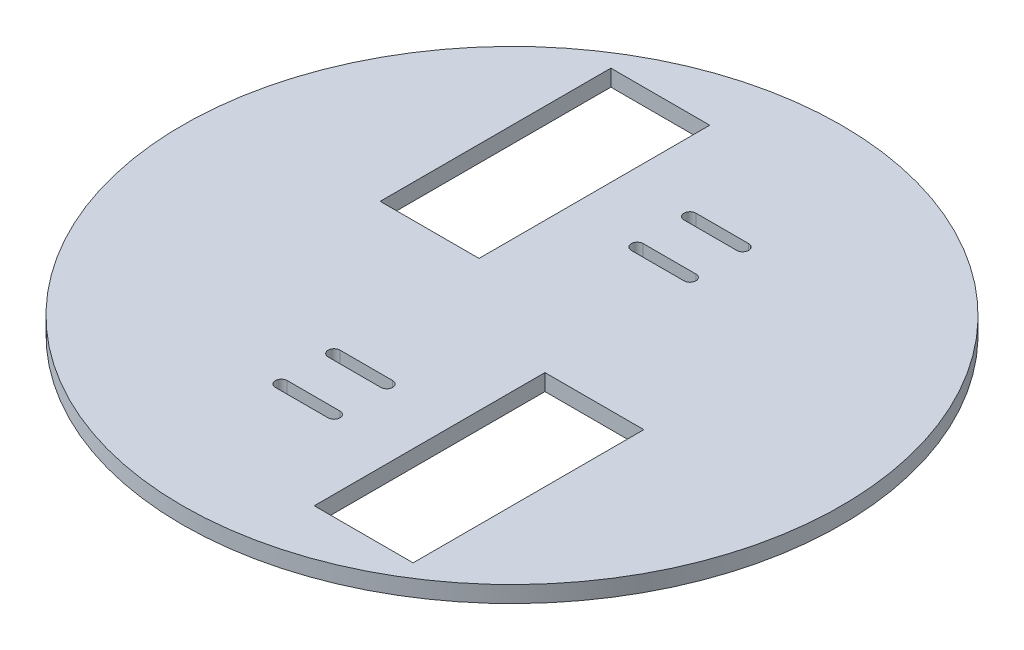
ISO-10303-21;
HEADER;
FILE_DESCRIPTION(('STEP AP214'),'2;1');
FILE_NAME('part.step','',(''),(''),'','','');
FILE_SCHEMA(('AUTOMOTIVE_DESIGN { 1 0 10303 214 1 1 1 1 }'));
ENDSEC;
DATA;
#1=APPLICATION_CONTEXT('core data for automotive mechanical design processes');
#2=APPLICATION_PROTOCOL_DEFINITION('international standard','automotive_design',2000,#1);
#3=PRODUCT_CONTEXT('',#1,'mechanical');
#4=PRODUCT('Part','Part','',(#3));
#5=PRODUCT_RELATED_PRODUCT_CATEGORY('part','',(#4));
#6=PRODUCT_DEFINITION_FORMATION('','',#4);
#7=PRODUCT_DEFINITION_CONTEXT('part definition',#1,'design');
#8=PRODUCT_DEFINITION('design','',#6,#7);
#9=PRODUCT_DEFINITION_SHAPE('','',#8);
#10=(LENGTH_UNIT() NAMED_UNIT(*) SI_UNIT(.MILLI.,.METRE.));
#11=(NAMED_UNIT(*) PLANE_ANGLE_UNIT() SI_UNIT($,.RADIAN.));
#12=(NAMED_UNIT(*) SI_UNIT($,.STERADIAN.) SOLID_ANGLE_UNIT());
#13=UNCERTAINTY_MEASURE_WITH_UNIT(LENGTH_MEASURE(1.E-05),#10,'distance_accuracy_value','');
#14=(GEOMETRIC_REPRESENTATION_CONTEXT(3) GLOBAL_UNCERTAINTY_ASSIGNED_CONTEXT((#13)) GLOBAL_UNIT_ASSIGNED_CONTEXT((#10,
#11,#12)) REPRESENTATION_CONTEXT('',''));
#15=CARTESIAN_POINT('',(0.,0.,0.));
#16=DIRECTION('',(0.,0.,1.));
#17=DIRECTION('',(1.,0.,0.));
#18=AXIS2_PLACEMENT_3D('',#15,#16,#17);
#19=CARTESIAN_POINT('',(0.,5.,0.));
#20=DIRECTION('',(0.,1.,0.));
#21=DIRECTION('',(0.,0.,1.));
#22=AXIS2_PLACEMENT_3D('',#19,#20,#21);
#23=PLANE('',#22);
#24=CARTESIAN_POINT('',(0.,5.,0.));
#25=DIRECTION('',(0.,1.,0.));
#26=DIRECTION('',(0.,0.,1.));
#27=AXIS2_PLACEMENT_3D('',#24,#25,#26);
#28=CIRCLE('',#27,100.);
#29=CARTESIAN_POINT('',(0.,5.,100.));
#30=VERTEX_POINT('',#29);
#31=EDGE_CURVE('E11',#30,#30,#28,.T.);
#32=ORIENTED_EDGE('',*,*,#31,.T.);
#33=EDGE_LOOP('',(#32));
#34=FACE_BOUND('',#33,.T.);
#35=DIRECTION('',(1.,0.,0.));
#36=VECTOR('',#35,1.);
#37=CARTESIAN_POINT('',(20.,5.,80.));
#38=LINE('',#37,#36);
#39=CARTESIAN_POINT('',(20.,5.,80.));
#40=VERTEX_POINT('',#39);
#41=CARTESIAN_POINT('',(50.,5.,80.));
#42=VERTEX_POINT('',#41);
#43=EDGE_CURVE('E371',#40,#42,#38,.T.);
#44=ORIENTED_EDGE('',*,*,#43,.F.);
#45=DIRECTION('',(0.,0.,1.));
#46=VECTOR('',#45,1.);
#47=CARTESIAN_POINT('',(20.,5.,80.));
#48=LINE('',#47,#46);
#49=CARTESIAN_POINT('',(20.,5.,10.));
#50=VERTEX_POINT('',#49);
#51=EDGE_CURVE('E369',#50,#40,#48,.T.);
#52=ORIENTED_EDGE('',*,*,#51,.F.);
#53=DIRECTION('',(-1.,0.,0.));
#54=VECTOR('',#53,1.);
#55=CARTESIAN_POINT('',(20.,5.,10.));
#56=LINE('',#55,#54);
#57=CARTESIAN_POINT('',(50.,5.,10.));
#58=VERTEX_POINT('',#57);
#59=EDGE_CURVE('E377',#58,#50,#56,.T.);
#60=ORIENTED_EDGE('',*,*,#59,.F.);
#61=DIRECTION('',(0.,0.,-1.));
#62=VECTOR('',#61,1.);
#63=CARTESIAN_POINT('',(50.,5.,80.));
#64=LINE('',#63,#62);
#65=EDGE_CURVE('E374',#42,#58,#64,.T.);
#66=ORIENTED_EDGE('',*,*,#65,.F.);
#67=EDGE_LOOP('',(#44,#52,#60,#66));
#68=FACE_BOUND('',#67,.T.);
#69=DIRECTION('',(1.,0.,0.));
#70=VECTOR('',#69,1.);
#71=CARTESIAN_POINT('',(-17.0000000000001,5.,54.7999999999999));
#72=LINE('',#71,#70);
#73=CARTESIAN_POINT('',(-17.0000000000001,5.,54.7999999999999));
#74=VERTEX_POINT('',#73);
#75=CARTESIAN_POINT('',(-1.00000000000005,5.,54.8));
#76=VERTEX_POINT('',#75);
#77=EDGE_CURVE('E366',#74,#76,#72,.T.);
#78=ORIENTED_EDGE('',*,*,#77,.F.);
#79=CARTESIAN_POINT('',(-17.,5.,52.9999999999999));
#80=DIRECTION('',(0.,1.,0.));
#81=DIRECTION('',(0.,0.,-1.));
#82=AXIS2_PLACEMENT_3D('',#79,#80,#81);
#83=CIRCLE('',#82,1.8);
#84=CARTESIAN_POINT('',(-17.,5.,51.1999999999999));
#85=VERTEX_POINT('',#84);
#86=EDGE_CURVE('E354',#85,#74,#83,.T.);
#87=ORIENTED_EDGE('',*,*,#86,.F.);
#88=DIRECTION('',(-1.,0.,0.));
#89=VECTOR('',#88,1.);
#90=CARTESIAN_POINT('',(-17.,5.,51.1999999999999));
#91=LINE('',#90,#89);
#92=CARTESIAN_POINT('',(-1.00000000000003,5.,51.2));
#93=VERTEX_POINT('',#92);
#94=EDGE_CURVE('E349',#93,#85,#91,.T.);
#95=ORIENTED_EDGE('',*,*,#94,.F.);
#96=CARTESIAN_POINT('',(-1.00000000000004,5.,53.));
#97=DIRECTION('',(0.,1.,0.));
#98=DIRECTION('',(0.,0.,-1.));
#99=AXIS2_PLACEMENT_3D('',#96,#97,#98);
#100=CIRCLE('',#99,1.8);
#101=EDGE_CURVE('E363',#76,#93,#100,.T.);
#102=ORIENTED_EDGE('',*,*,#101,.F.);
#103=EDGE_LOOP('',(#78,#87,#95,#102));
#104=FACE_BOUND('',#103,.T.);
#105=DIRECTION('',(1.,0.,0.));
#106=VECTOR('',#105,1.);
#107=CARTESIAN_POINT('',(-17.,5.,38.8));
#108=LINE('',#107,#106);
#109=CARTESIAN_POINT('',(-17.,5.,38.8));
#110=VERTEX_POINT('',#109);
#111=CARTESIAN_POINT('',(-1.,5.,38.8));
#112=VERTEX_POINT('',#111);
#113=EDGE_CURVE('E309',#110,#112,#108,.T.);
#114=ORIENTED_EDGE('',*,*,#113,.F.);
#115=CARTESIAN_POINT('',(-17.,5.,37.));
#116=DIRECTION('',(0.,1.,0.));
#117=DIRECTION('',(0.,0.,1.));
#118=AXIS2_PLACEMENT_3D('',#115,#116,#117);
#119=CIRCLE('',#118,1.8);
#120=CARTESIAN_POINT('',(-17.,5.,35.2));
#121=VERTEX_POINT('',#120);
#122=EDGE_CURVE('E307',#121,#110,#119,.T.);
#123=ORIENTED_EDGE('',*,*,#122,.F.);
#124=DIRECTION('',(-1.,0.,0.));
#125=VECTOR('',#124,1.);
#126=CARTESIAN_POINT('',(-17.,5.,35.2));
#127=LINE('',#126,#125);
#128=CARTESIAN_POINT('',(-1.,5.,35.2));
#129=VERTEX_POINT('',#128);
#130=EDGE_CURVE('E315',#129,#121,#127,.T.);
#131=ORIENTED_EDGE('',*,*,#130,.F.);
#132=CARTESIAN_POINT('',(-1.,5.,37.));
#133=DIRECTION('',(0.,1.,0.));
#134=DIRECTION('',(0.,0.,1.));
#135=AXIS2_PLACEMENT_3D('',#132,#133,#134);
#136=CIRCLE('',#135,1.8);
#137=EDGE_CURVE('E312',#112,#129,#136,.T.);
#138=ORIENTED_EDGE('',*,*,#137,.F.);
#139=EDGE_LOOP('',(#114,#123,#131,#138));
#140=FACE_BOUND('',#139,.T.);
#141=DIRECTION('',(-1.,0.,0.));
#142=VECTOR('',#141,1.);
#143=CARTESIAN_POINT('',(-20.,5.,-80.));
#144=LINE('',#143,#142);
#145=CARTESIAN_POINT('',(-20.,5.,-80.));
#146=VERTEX_POINT('',#145);
#147=CARTESIAN_POINT('',(-50.,5.,-80.));
#148=VERTEX_POINT('',#147);
#149=EDGE_CURVE('E278',#146,#148,#144,.T.);
#150=ORIENTED_EDGE('',*,*,#149,.F.);
#151=DIRECTION('',(0.,0.,-1.));
#152=VECTOR('',#151,1.);
#153=CARTESIAN_POINT('',(-20.,5.,-80.));
#154=LINE('',#153,#152);
#155=CARTESIAN_POINT('',(-20.,5.,-10.));
#156=VERTEX_POINT('',#155);
#157=EDGE_CURVE('E276',#156,#146,#154,.T.);
#158=ORIENTED_EDGE('',*,*,#157,.F.);
#159=DIRECTION('',(1.,0.,0.));
#160=VECTOR('',#159,1.);
#161=CARTESIAN_POINT('',(-20.,5.,-10.));
#162=LINE('',#161,#160);
#163=CARTESIAN_POINT('',(-50.,5.,-10.));
#164=VERTEX_POINT('',#163);
#165=EDGE_CURVE('E284',#164,#156,#162,.T.);
#166=ORIENTED_EDGE('',*,*,#165,.F.);
#167=DIRECTION('',(0.,0.,1.));
#168=VECTOR('',#167,1.);
#169=CARTESIAN_POINT('',(-50.,5.,-80.));
#170=LINE('',#169,#168);
#171=EDGE_CURVE('E281',#148,#164,#170,.T.);
#172=ORIENTED_EDGE('',*,*,#171,.F.);
#173=EDGE_LOOP('',(#150,#158,#166,#172));
#174=FACE_BOUND('',#173,.T.);
#175=DIRECTION('',(-1.,0.,0.));
#176=VECTOR('',#175,1.);
#177=CARTESIAN_POINT('',(17.0000000000001,5.,-54.7999999999999));
#178=LINE('',#177,#176);
#179=CARTESIAN_POINT('',(17.0000000000001,5.,-54.7999999999999));
#180=VERTEX_POINT('',#179);
#181=CARTESIAN_POINT('',(1.00000000000005,5.,-54.8));
#182=VERTEX_POINT('',#181);
#183=EDGE_CURVE('E250',#180,#182,#178,.T.);
#184=ORIENTED_EDGE('',*,*,#183,.F.);
#185=CARTESIAN_POINT('',(17.,5.,-52.9999999999999));
#186=DIRECTION('',(0.,1.,0.));
#187=DIRECTION('',(0.,0.,1.));
#188=AXIS2_PLACEMENT_3D('',#185,#186,#187);
#189=CIRCLE('',#188,1.8);
#190=CARTESIAN_POINT('',(17.,5.,-51.1999999999999));
#191=VERTEX_POINT('',#190);
#192=EDGE_CURVE('E248',#191,#180,#189,.T.);
#193=ORIENTED_EDGE('',*,*,#192,.F.);
#194=DIRECTION('',(1.,0.,0.));
#195=VECTOR('',#194,1.);
#196=CARTESIAN_POINT('',(17.,5.,-51.1999999999999));
#197=LINE('',#196,#195);
#198=CARTESIAN_POINT('',(1.00000000000003,5.,-51.2));
#199=VERTEX_POINT('',#198);
#200=EDGE_CURVE('E255',#199,#191,#197,.T.);
#201=ORIENTED_EDGE('',*,*,#200,.F.);
#202=CARTESIAN_POINT('',(1.00000000000004,5.,-53.));
#203=DIRECTION('',(0.,1.,0.));
#204=DIRECTION('',(0.,0.,1.));
#205=AXIS2_PLACEMENT_3D('',#202,#203,#204);
#206=CIRCLE('',#205,1.8);
#207=EDGE_CURVE('E253',#182,#199,#206,.T.);
#208=ORIENTED_EDGE('',*,*,#207,.F.);
#209=EDGE_LOOP('',(#184,#193,#201,#208));
#210=FACE_BOUND('',#209,.T.);
#211=DIRECTION('',(-1.,0.,0.));
#212=VECTOR('',#211,1.);
#213=CARTESIAN_POINT('',(17.,5.,-38.8));
#214=LINE('',#213,#212);
#215=CARTESIAN_POINT('',(17.,5.,-38.8));
#216=VERTEX_POINT('',#215);
#217=CARTESIAN_POINT('',(1.,5.,-38.8));
#218=VERTEX_POINT('',#217);
#219=EDGE_CURVE('E218',#216,#218,#214,.T.);
#220=ORIENTED_EDGE('',*,*,#219,.F.);
#221=CARTESIAN_POINT('',(17.,5.,-37.));
#222=DIRECTION('',(0.,1.,0.));
#223=DIRECTION('',(0.,0.,-1.));
#224=AXIS2_PLACEMENT_3D('',#221,#222,#223);
#225=CIRCLE('',#224,1.8);
#226=CARTESIAN_POINT('',(17.,5.,-35.2));
#227=VERTEX_POINT('',#226);
#228=EDGE_CURVE('E208',#227,#216,#225,.T.);
#229=ORIENTED_EDGE('',*,*,#228,.F.);
#230=DIRECTION('',(1.,0.,0.));
#231=VECTOR('',#230,1.);
#232=CARTESIAN_POINT('',(17.,5.,-35.2));
#233=LINE('',#232,#231);
#234=CARTESIAN_POINT('',(1.,5.,-35.2));
#235=VERTEX_POINT('',#234);
#236=EDGE_CURVE('E232',#235,#227,#233,.T.);
#237=ORIENTED_EDGE('',*,*,#236,.F.);
#238=CARTESIAN_POINT('',(1.,5.,-37.));
#239=DIRECTION('',(0.,1.,0.));
#240=DIRECTION('',(0.,0.,-1.));
#241=AXIS2_PLACEMENT_3D('',#238,#239,#240);
#242=CIRCLE('',#241,1.8);
#243=EDGE_CURVE('E230',#218,#235,#242,.T.);
#244=ORIENTED_EDGE('',*,*,#243,.F.);
#245=EDGE_LOOP('',(#220,#229,#237,#244));
#246=FACE_BOUND('',#245,.T.);
#247=ADVANCED_FACE('F46',(#34,#68,#104,#140,#174,#210,#246),#23,.T.);
#248=CARTESIAN_POINT('',(0.,0.,0.));
#249=DIRECTION('',(0.,1.,0.));
#250=DIRECTION('',(0.,0.,1.));
#251=AXIS2_PLACEMENT_3D('',#248,#249,#250);
#252=PLANE('',#251);
#253=CARTESIAN_POINT('',(17.,0.,-52.9999999999999));
#254=DIRECTION('',(0.,1.,0.));
#255=DIRECTION('',(0.,0.,1.));
#256=AXIS2_PLACEMENT_3D('',#253,#254,#255);
#257=CIRCLE('',#256,1.8);
#258=CARTESIAN_POINT('',(17.,0.,-51.1999999999999));
#259=VERTEX_POINT('',#258);
#260=CARTESIAN_POINT('',(17.0000000000001,0.,-54.7999999999999));
#261=VERTEX_POINT('',#260);
#262=EDGE_CURVE('E258',#259,#261,#257,.T.);
#263=ORIENTED_EDGE('',*,*,#262,.T.);
#264=DIRECTION('',(-1.,0.,0.));
#265=VECTOR('',#264,1.);
#266=CARTESIAN_POINT('',(17.0000000000001,0.,-54.7999999999999));
#267=LINE('',#266,#265);
#268=CARTESIAN_POINT('',(1.00000000000005,0.,-54.8));
#269=VERTEX_POINT('',#268);
#270=EDGE_CURVE('E261',#261,#269,#267,.T.);
#271=ORIENTED_EDGE('',*,*,#270,.T.);
#272=CARTESIAN_POINT('',(1.00000000000004,0.,-53.));
#273=DIRECTION('',(0.,1.,0.));
#274=DIRECTION('',(0.,0.,1.));
#275=AXIS2_PLACEMENT_3D('',#272,#273,#274);
#276=CIRCLE('',#275,1.8);
#277=CARTESIAN_POINT('',(1.00000000000003,0.,-51.2));
#278=VERTEX_POINT('',#277);
#279=EDGE_CURVE('E264',#269,#278,#276,.T.);
#280=ORIENTED_EDGE('',*,*,#279,.T.);
#281=DIRECTION('',(1.,0.,0.));
#282=VECTOR('',#281,1.);
#283=CARTESIAN_POINT('',(17.,0.,-51.1999999999999));
#284=LINE('',#283,#282);
#285=EDGE_CURVE('E251',#278,#259,#284,.T.);
#286=ORIENTED_EDGE('',*,*,#285,.T.);
#287=EDGE_LOOP('',(#263,#271,#280,#286));
#288=FACE_BOUND('',#287,.T.);
#289=CARTESIAN_POINT('',(-17.,0.,37.));
#290=DIRECTION('',(0.,1.,0.));
#291=DIRECTION('',(0.,0.,1.));
#292=AXIS2_PLACEMENT_3D('',#289,#290,#291);
#293=CIRCLE('',#292,1.8);
#294=CARTESIAN_POINT('',(-17.,0.,35.2));
#295=VERTEX_POINT('',#294);
#296=CARTESIAN_POINT('',(-17.,0.,38.8));
#297=VERTEX_POINT('',#296);
#298=EDGE_CURVE('E318',#295,#297,#293,.T.);
#299=ORIENTED_EDGE('',*,*,#298,.T.);
#300=DIRECTION('',(1.,0.,0.));
#301=VECTOR('',#300,1.);
#302=CARTESIAN_POINT('',(-17.,0.,38.8));
#303=LINE('',#302,#301);
#304=CARTESIAN_POINT('',(-1.,0.,38.8));
#305=VERTEX_POINT('',#304);
#306=EDGE_CURVE('E321',#297,#305,#303,.T.);
#307=ORIENTED_EDGE('',*,*,#306,.T.);
#308=CARTESIAN_POINT('',(-1.,0.,37.));
#309=DIRECTION('',(0.,1.,0.));
#310=DIRECTION('',(0.,0.,1.));
#311=AXIS2_PLACEMENT_3D('',#308,#309,#310);
#312=CIRCLE('',#311,1.8);
#313=CARTESIAN_POINT('',(-1.,0.,35.2));
#314=VERTEX_POINT('',#313);
#315=EDGE_CURVE('E325',#305,#314,#312,.T.);
#316=ORIENTED_EDGE('',*,*,#315,.T.);
#317=DIRECTION('',(-1.,0.,0.));
#318=VECTOR('',#317,1.);
#319=CARTESIAN_POINT('',(-17.,0.,35.2));
#320=LINE('',#319,#318);
#321=EDGE_CURVE('E310',#314,#295,#320,.T.);
#322=ORIENTED_EDGE('',*,*,#321,.T.);
#323=EDGE_LOOP('',(#299,#307,#316,#322));
#324=FACE_BOUND('',#323,.T.);
#325=DIRECTION('',(0.,0.,1.));
#326=VECTOR('',#325,1.);
#327=CARTESIAN_POINT('',(20.,0.,80.));
#328=LINE('',#327,#326);
#329=CARTESIAN_POINT('',(20.,0.,10.));
#330=VERTEX_POINT('',#329);
#331=CARTESIAN_POINT('',(20.,0.,80.));
#332=VERTEX_POINT('',#331);
#333=EDGE_CURVE('E339',#330,#332,#328,.T.);
#334=ORIENTED_EDGE('',*,*,#333,.T.);
#335=DIRECTION('',(1.,0.,0.));
#336=VECTOR('',#335,1.);
#337=CARTESIAN_POINT('',(20.,0.,80.));
#338=LINE('',#337,#336);
#339=CARTESIAN_POINT('',(50.,0.,80.));
#340=VERTEX_POINT('',#339);
#341=EDGE_CURVE('E382',#332,#340,#338,.T.);
#342=ORIENTED_EDGE('',*,*,#341,.T.);
#343=DIRECTION('',(0.,0.,-1.));
#344=VECTOR('',#343,1.);
#345=CARTESIAN_POINT('',(50.,0.,80.));
#346=LINE('',#345,#344);
#347=CARTESIAN_POINT('',(50.,0.,10.));
#348=VERTEX_POINT('',#347);
#349=EDGE_CURVE('E385',#340,#348,#346,.T.);
#350=ORIENTED_EDGE('',*,*,#349,.T.);
#351=DIRECTION('',(-1.,0.,0.));
#352=VECTOR('',#351,1.);
#353=CARTESIAN_POINT('',(20.,0.,10.));
#354=LINE('',#353,#352);
#355=EDGE_CURVE('E372',#348,#330,#354,.T.);
#356=ORIENTED_EDGE('',*,*,#355,.T.);
#357=EDGE_LOOP('',(#334,#342,#350,#356));
#358=FACE_BOUND('',#357,.T.);
#359=CARTESIAN_POINT('',(0.,0.,0.));
#360=DIRECTION('',(0.,1.,0.));
#361=DIRECTION('',(0.,0.,1.));
#362=AXIS2_PLACEMENT_3D('',#359,#360,#361);
#363=CIRCLE('',#362,100.);
#364=CARTESIAN_POINT('',(0.,0.,100.));
#365=VERTEX_POINT('',#364);
#366=EDGE_CURVE('E50',#365,#365,#363,.T.);
#367=ORIENTED_EDGE('',*,*,#366,.F.);
#368=EDGE_LOOP('',(#367));
#369=FACE_BOUND('',#368,.T.);
#370=CARTESIAN_POINT('',(-17.,0.,52.9999999999999));
#371=DIRECTION('',(0.,1.,0.));
#372=DIRECTION('',(0.,0.,-1.));
#373=AXIS2_PLACEMENT_3D('',#370,#371,#372);
#374=CIRCLE('',#373,1.8);
#375=CARTESIAN_POINT('',(-17.,0.,51.1999999999999));
#376=VERTEX_POINT('',#375);
#377=CARTESIAN_POINT('',(-17.0000000000001,0.,54.7999999999999));
#378=VERTEX_POINT('',#377);
#379=EDGE_CURVE('E322',#376,#378,#374,.T.);
#380=ORIENTED_EDGE('',*,*,#379,.T.);
#381=DIRECTION('',(1.,0.,0.));
#382=VECTOR('',#381,1.);
#383=CARTESIAN_POINT('',(-17.0000000000001,0.,54.7999999999999));
#384=LINE('',#383,#382);
#385=CARTESIAN_POINT('',(-1.00000000000005,0.,54.8));
#386=VERTEX_POINT('',#385);
#387=EDGE_CURVE('E357',#378,#386,#384,.T.);
#388=ORIENTED_EDGE('',*,*,#387,.T.);
#389=CARTESIAN_POINT('',(-1.00000000000004,0.,53.));
#390=DIRECTION('',(0.,1.,0.));
#391=DIRECTION('',(0.,0.,-1.));
#392=AXIS2_PLACEMENT_3D('',#389,#390,#391);
#393=CIRCLE('',#392,1.8);
#394=CARTESIAN_POINT('',(-1.00000000000003,0.,51.2));
#395=VERTEX_POINT('',#394);
#396=EDGE_CURVE('E353',#386,#395,#393,.T.);
#397=ORIENTED_EDGE('',*,*,#396,.T.);
#398=DIRECTION('',(-1.,0.,0.));
#399=VECTOR('',#398,1.);
#400=CARTESIAN_POINT('',(-17.,0.,51.1999999999999));
#401=LINE('',#400,#399);
#402=EDGE_CURVE('E350',#395,#376,#401,.T.);
#403=ORIENTED_EDGE('',*,*,#402,.T.);
#404=EDGE_LOOP('',(#380,#388,#397,#403));
#405=FACE_BOUND('',#404,.T.);
#406=DIRECTION('',(0.,0.,-1.));
#407=VECTOR('',#406,1.);
#408=CARTESIAN_POINT('',(-20.,0.,-80.));
#409=LINE('',#408,#407);
#410=CARTESIAN_POINT('',(-20.,0.,-10.));
#411=VERTEX_POINT('',#410);
#412=CARTESIAN_POINT('',(-20.,0.,-80.));
#413=VERTEX_POINT('',#412);
#414=EDGE_CURVE('E226',#411,#413,#409,.T.);
#415=ORIENTED_EDGE('',*,*,#414,.T.);
#416=DIRECTION('',(-1.,0.,0.));
#417=VECTOR('',#416,1.);
#418=CARTESIAN_POINT('',(-20.,0.,-80.));
#419=LINE('',#418,#417);
#420=CARTESIAN_POINT('',(-50.,0.,-80.));
#421=VERTEX_POINT('',#420);
#422=EDGE_CURVE('E289',#413,#421,#419,.T.);
#423=ORIENTED_EDGE('',*,*,#422,.T.);
#424=DIRECTION('',(0.,0.,1.));
#425=VECTOR('',#424,1.);
#426=CARTESIAN_POINT('',(-50.,0.,-80.));
#427=LINE('',#426,#425);
#428=CARTESIAN_POINT('',(-50.,0.,-10.));
#429=VERTEX_POINT('',#428);
#430=EDGE_CURVE('E292',#421,#429,#427,.T.);
#431=ORIENTED_EDGE('',*,*,#430,.T.);
#432=DIRECTION('',(1.,0.,0.));
#433=VECTOR('',#432,1.);
#434=CARTESIAN_POINT('',(-20.,0.,-10.));
#435=LINE('',#434,#433);
#436=EDGE_CURVE('E279',#429,#411,#435,.T.);
#437=ORIENTED_EDGE('',*,*,#436,.T.);
#438=EDGE_LOOP('',(#415,#423,#431,#437));
#439=FACE_BOUND('',#438,.T.);
#440=CARTESIAN_POINT('',(17.,0.,-37.));
#441=DIRECTION('',(0.,1.,0.));
#442=DIRECTION('',(0.,0.,-1.));
#443=AXIS2_PLACEMENT_3D('',#440,#441,#442);
#444=CIRCLE('',#443,1.8);
#445=CARTESIAN_POINT('',(17.,0.,-35.2));
#446=VERTEX_POINT('',#445);
#447=CARTESIAN_POINT('',(17.,0.,-38.8));
#448=VERTEX_POINT('',#447);
#449=EDGE_CURVE('E236',#446,#448,#444,.T.);
#450=ORIENTED_EDGE('',*,*,#449,.T.);
#451=DIRECTION('',(-1.,0.,0.));
#452=VECTOR('',#451,1.);
#453=CARTESIAN_POINT('',(17.,0.,-38.8));
#454=LINE('',#453,#452);
#455=CARTESIAN_POINT('',(1.,0.,-38.8));
#456=VERTEX_POINT('',#455);
#457=EDGE_CURVE('E225',#448,#456,#454,.T.);
#458=ORIENTED_EDGE('',*,*,#457,.T.);
#459=CARTESIAN_POINT('',(1.,0.,-37.));
#460=DIRECTION('',(0.,1.,0.));
#461=DIRECTION('',(0.,0.,-1.));
#462=AXIS2_PLACEMENT_3D('',#459,#460,#461);
#463=CIRCLE('',#462,1.8);
#464=CARTESIAN_POINT('',(1.,0.,-35.2));
#465=VERTEX_POINT('',#464);
#466=EDGE_CURVE('E240',#456,#465,#463,.T.);
#467=ORIENTED_EDGE('',*,*,#466,.T.);
#468=DIRECTION('',(1.,0.,0.));
#469=VECTOR('',#468,1.);
#470=CARTESIAN_POINT('',(17.,0.,-35.2));
#471=LINE('',#470,#469);
#472=EDGE_CURVE('E219',#465,#446,#471,.T.);
#473=ORIENTED_EDGE('',*,*,#472,.T.);
#474=EDGE_LOOP('',(#450,#458,#467,#473));
#475=FACE_BOUND('',#474,.T.);
#476=ADVANCED_FACE('F404',(#288,#324,#358,#369,#405,#439,#475),#252,.F.);
#477=CARTESIAN_POINT('',(0.,5.,0.));
#478=DIRECTION('',(0.,-1.,0.));
#479=DIRECTION('',(0.,0.,-1.));
#480=AXIS2_PLACEMENT_3D('',#477,#478,#479);
#481=CYLINDRICAL_SURFACE('',#480,100.);
#482=ORIENTED_EDGE('',*,*,#31,.F.);
#483=EDGE_LOOP('',(#482));
#484=FACE_BOUND('',#483,.T.);
#485=ORIENTED_EDGE('',*,*,#366,.T.);
#486=EDGE_LOOP('',(#485));
#487=FACE_BOUND('',#486,.T.);
#488=ADVANCED_FACE('F48',(#484,#487),#481,.T.);
#489=CARTESIAN_POINT('',(20.,5.,80.));
#490=DIRECTION('',(1.,0.,0.));
#491=DIRECTION('',(0.,0.,-1.));
#492=AXIS2_PLACEMENT_3D('',#489,#490,#491);
#493=PLANE('',#492);
#494=ORIENTED_EDGE('',*,*,#333,.F.);
#495=DIRECTION('',(0.,-1.,0.));
#496=VECTOR('',#495,1.);
#497=CARTESIAN_POINT('',(20.,5.,10.));
#498=LINE('',#497,#496);
#499=EDGE_CURVE('E379',#50,#330,#498,.T.);
#500=ORIENTED_EDGE('',*,*,#499,.F.);
#501=ORIENTED_EDGE('',*,*,#51,.T.);
#502=DIRECTION('',(0.,-1.,0.));
#503=VECTOR('',#502,1.);
#504=CARTESIAN_POINT('',(20.,5.,80.));
#505=LINE('',#504,#503);
#506=EDGE_CURVE('E396',#40,#332,#505,.T.);
#507=ORIENTED_EDGE('',*,*,#506,.T.);
#508=EDGE_LOOP('',(#494,#500,#501,#507));
#509=FACE_BOUND('',#508,.T.);
#510=ADVANCED_FACE('F430',(#509),#493,.T.);
#511=CARTESIAN_POINT('',(20.,5.,80.));
#512=DIRECTION('',(0.,0.,-1.));
#513=DIRECTION('',(-1.,0.,0.));
#514=AXIS2_PLACEMENT_3D('',#511,#512,#513);
#515=PLANE('',#514);
#516=ORIENTED_EDGE('',*,*,#341,.F.);
#517=ORIENTED_EDGE('',*,*,#506,.F.);
#518=ORIENTED_EDGE('',*,*,#43,.T.);
#519=DIRECTION('',(0.,-1.,0.));
#520=VECTOR('',#519,1.);
#521=CARTESIAN_POINT('',(50.,5.,80.));
#522=LINE('',#521,#520);
#523=EDGE_CURVE('E394',#42,#340,#522,.T.);
#524=ORIENTED_EDGE('',*,*,#523,.T.);
#525=EDGE_LOOP('',(#516,#517,#518,#524));
#526=FACE_BOUND('',#525,.T.);
#527=ADVANCED_FACE('F433',(#526),#515,.T.);
#528=CARTESIAN_POINT('',(50.,5.,80.));
#529=DIRECTION('',(-1.,0.,0.));
#530=DIRECTION('',(0.,0.,1.));
#531=AXIS2_PLACEMENT_3D('',#528,#529,#530);
#532=PLANE('',#531);
#533=ORIENTED_EDGE('',*,*,#349,.F.);
#534=ORIENTED_EDGE('',*,*,#523,.F.);
#535=ORIENTED_EDGE('',*,*,#65,.T.);
#536=DIRECTION('',(0.,-1.,0.));
#537=VECTOR('',#536,1.);
#538=CARTESIAN_POINT('',(50.,5.,10.));
#539=LINE('',#538,#537);
#540=EDGE_CURVE('E392',#58,#348,#539,.T.);
#541=ORIENTED_EDGE('',*,*,#540,.T.);
#542=EDGE_LOOP('',(#533,#534,#535,#541));
#543=FACE_BOUND('',#542,.T.);
#544=ADVANCED_FACE('F436',(#543),#532,.T.);
#545=CARTESIAN_POINT('',(20.,5.,10.));
#546=DIRECTION('',(0.,0.,1.));
#547=DIRECTION('',(1.,0.,0.));
#548=AXIS2_PLACEMENT_3D('',#545,#546,#547);
#549=PLANE('',#548);
#550=ORIENTED_EDGE('',*,*,#355,.F.);
#551=ORIENTED_EDGE('',*,*,#540,.F.);
#552=ORIENTED_EDGE('',*,*,#59,.T.);
#553=ORIENTED_EDGE('',*,*,#499,.T.);
#554=EDGE_LOOP('',(#550,#551,#552,#553));
#555=FACE_BOUND('',#554,.T.);
#556=ADVANCED_FACE('F440',(#555),#549,.T.);
#557=CARTESIAN_POINT('',(-17.,5.,52.9999999999999));
#558=DIRECTION('',(0.,-1.,0.));
#559=DIRECTION('',(0.,0.,-1.));
#560=AXIS2_PLACEMENT_3D('',#557,#558,#559);
#561=CYLINDRICAL_SURFACE('',#560,1.8);
#562=ORIENTED_EDGE('',*,*,#379,.F.);
#563=DIRECTION('',(0.,-1.,0.));
#564=VECTOR('',#563,1.);
#565=CARTESIAN_POINT('',(-17.,5.,51.1999999999999));
#566=LINE('',#565,#564);
#567=EDGE_CURVE('E346',#85,#376,#566,.T.);
#568=ORIENTED_EDGE('',*,*,#567,.F.);
#569=ORIENTED_EDGE('',*,*,#86,.T.);
#570=DIRECTION('',(0.,-1.,0.));
#571=VECTOR('',#570,1.);
#572=CARTESIAN_POINT('',(-17.0000000000001,5.,54.7999999999999));
#573=LINE('',#572,#571);
#574=EDGE_CURVE('E306',#74,#378,#573,.T.);
#575=ORIENTED_EDGE('',*,*,#574,.T.);
#576=EDGE_LOOP('',(#562,#568,#569,#575));
#577=FACE_BOUND('',#576,.T.);
#578=ADVANCED_FACE('F444',(#577),#561,.F.);
#579=CARTESIAN_POINT('',(-17.0000000000001,5.,54.7999999999999));
#580=DIRECTION('',(0.,0.,-1.));
#581=DIRECTION('',(-1.,0.,0.));
#582=AXIS2_PLACEMENT_3D('',#579,#580,#581);
#583=PLANE('',#582);
#584=ORIENTED_EDGE('',*,*,#387,.F.);
#585=ORIENTED_EDGE('',*,*,#574,.F.);
#586=ORIENTED_EDGE('',*,*,#77,.T.);
#587=DIRECTION('',(0.,-1.,0.));
#588=VECTOR('',#587,1.);
#589=CARTESIAN_POINT('',(-1.00000000000005,5.,54.8));
#590=LINE('',#589,#588);
#591=EDGE_CURVE('E342',#76,#386,#590,.T.);
#592=ORIENTED_EDGE('',*,*,#591,.T.);
#593=EDGE_LOOP('',(#584,#585,#586,#592));
#594=FACE_BOUND('',#593,.T.);
#595=ADVANCED_FACE('F454',(#594),#583,.T.);
#596=CARTESIAN_POINT('',(-1.00000000000004,5.,53.));
#597=DIRECTION('',(0.,-1.,0.));
#598=DIRECTION('',(0.,0.,-1.));
#599=AXIS2_PLACEMENT_3D('',#596,#597,#598);
#600=CYLINDRICAL_SURFACE('',#599,1.8);
#601=ORIENTED_EDGE('',*,*,#396,.F.);
#602=ORIENTED_EDGE('',*,*,#591,.F.);
#603=ORIENTED_EDGE('',*,*,#101,.T.);
#604=DIRECTION('',(0.,-1.,0.));
#605=VECTOR('',#604,1.);
#606=CARTESIAN_POINT('',(-1.00000000000003,5.,51.2));
#607=LINE('',#606,#605);
#608=EDGE_CURVE('E344',#93,#395,#607,.T.);
#609=ORIENTED_EDGE('',*,*,#608,.T.);
#610=EDGE_LOOP('',(#601,#602,#603,#609));
#611=FACE_BOUND('',#610,.T.);
#612=ADVANCED_FACE('F450',(#611),#600,.F.);
#613=CARTESIAN_POINT('',(-17.,5.,51.1999999999999));
#614=DIRECTION('',(0.,0.,1.));
#615=DIRECTION('',(1.,0.,0.));
#616=AXIS2_PLACEMENT_3D('',#613,#614,#615);
#617=PLANE('',#616);
#618=ORIENTED_EDGE('',*,*,#402,.F.);
#619=ORIENTED_EDGE('',*,*,#608,.F.);
#620=ORIENTED_EDGE('',*,*,#94,.T.);
#621=ORIENTED_EDGE('',*,*,#567,.T.);
#622=EDGE_LOOP('',(#618,#619,#620,#621));
#623=FACE_BOUND('',#622,.T.);
#624=ADVANCED_FACE('F446',(#623),#617,.T.);
#625=CARTESIAN_POINT('',(-17.,5.,37.));
#626=DIRECTION('',(0.,-1.,0.));
#627=DIRECTION('',(0.,0.,-1.));
#628=AXIS2_PLACEMENT_3D('',#625,#626,#627);
#629=CYLINDRICAL_SURFACE('',#628,1.8);
#630=ORIENTED_EDGE('',*,*,#298,.F.);
#631=DIRECTION('',(0.,-1.,0.));
#632=VECTOR('',#631,1.);
#633=CARTESIAN_POINT('',(-17.,5.,35.2));
#634=LINE('',#633,#632);
#635=EDGE_CURVE('E317',#121,#295,#634,.T.);
#636=ORIENTED_EDGE('',*,*,#635,.F.);
#637=ORIENTED_EDGE('',*,*,#122,.T.);
#638=DIRECTION('',(0.,-1.,0.));
#639=VECTOR('',#638,1.);
#640=CARTESIAN_POINT('',(-17.,5.,38.8));
#641=LINE('',#640,#639);
#642=EDGE_CURVE('E336',#110,#297,#641,.T.);
#643=ORIENTED_EDGE('',*,*,#642,.T.);
#644=EDGE_LOOP('',(#630,#636,#637,#643));
#645=FACE_BOUND('',#644,.T.);
#646=ADVANCED_FACE('F449',(#645),#629,.F.);
#647=CARTESIAN_POINT('',(-17.,5.,38.8));
#648=DIRECTION('',(0.,0.,-1.));
#649=DIRECTION('',(-1.,0.,0.));
#650=AXIS2_PLACEMENT_3D('',#647,#648,#649);
#651=PLANE('',#650);
#652=ORIENTED_EDGE('',*,*,#306,.F.);
#653=ORIENTED_EDGE('',*,*,#642,.F.);
#654=ORIENTED_EDGE('',*,*,#113,.T.);
#655=DIRECTION('',(0.,-1.,0.));
#656=VECTOR('',#655,1.);
#657=CARTESIAN_POINT('',(-1.,5.,38.8));
#658=LINE('',#657,#656);
#659=EDGE_CURVE('E334',#112,#305,#658,.T.);
#660=ORIENTED_EDGE('',*,*,#659,.T.);
#661=EDGE_LOOP('',(#652,#653,#654,#660));
#662=FACE_BOUND('',#661,.T.);
#663=ADVANCED_FACE('F464',(#662),#651,.T.);
#664=CARTESIAN_POINT('',(-1.,5.,37.));
#665=DIRECTION('',(0.,-1.,0.));
#666=DIRECTION('',(0.,0.,-1.));
#667=AXIS2_PLACEMENT_3D('',#664,#665,#666);
#668=CYLINDRICAL_SURFACE('',#667,1.8);
#669=ORIENTED_EDGE('',*,*,#315,.F.);
#670=ORIENTED_EDGE('',*,*,#659,.F.);
#671=ORIENTED_EDGE('',*,*,#137,.T.);
#672=DIRECTION('',(0.,-1.,0.));
#673=VECTOR('',#672,1.);
#674=CARTESIAN_POINT('',(-1.,5.,35.2));
#675=LINE('',#674,#673);
#676=EDGE_CURVE('E332',#129,#314,#675,.T.);
#677=ORIENTED_EDGE('',*,*,#676,.T.);
#678=EDGE_LOOP('',(#669,#670,#671,#677));
#679=FACE_BOUND('',#678,.T.);
#680=ADVANCED_FACE('F468',(#679),#668,.F.);
#681=CARTESIAN_POINT('',(-17.,5.,35.2));
#682=DIRECTION('',(0.,0.,1.));
#683=DIRECTION('',(1.,0.,0.));
#684=AXIS2_PLACEMENT_3D('',#681,#682,#683);
#685=PLANE('',#684);
#686=ORIENTED_EDGE('',*,*,#321,.F.);
#687=ORIENTED_EDGE('',*,*,#676,.F.);
#688=ORIENTED_EDGE('',*,*,#130,.T.);
#689=ORIENTED_EDGE('',*,*,#635,.T.);
#690=EDGE_LOOP('',(#686,#687,#688,#689));
#691=FACE_BOUND('',#690,.T.);
#692=ADVANCED_FACE('F472',(#691),#685,.T.);
#693=CARTESIAN_POINT('',(-20.,5.,-80.));
#694=DIRECTION('',(-1.,0.,0.));
#695=DIRECTION('',(0.,0.,1.));
#696=AXIS2_PLACEMENT_3D('',#693,#694,#695);
#697=PLANE('',#696);
#698=ORIENTED_EDGE('',*,*,#414,.F.);
#699=DIRECTION('',(0.,-1.,0.));
#700=VECTOR('',#699,1.);
#701=CARTESIAN_POINT('',(-20.,5.,-10.));
#702=LINE('',#701,#700);
#703=EDGE_CURVE('E286',#156,#411,#702,.T.);
#704=ORIENTED_EDGE('',*,*,#703,.F.);
#705=ORIENTED_EDGE('',*,*,#157,.T.);
#706=DIRECTION('',(0.,-1.,0.));
#707=VECTOR('',#706,1.);
#708=CARTESIAN_POINT('',(-20.,5.,-80.));
#709=LINE('',#708,#707);
#710=EDGE_CURVE('E303',#146,#413,#709,.T.);
#711=ORIENTED_EDGE('',*,*,#710,.T.);
#712=EDGE_LOOP('',(#698,#704,#705,#711));
#713=FACE_BOUND('',#712,.T.);
#714=ADVANCED_FACE('F475',(#713),#697,.T.);
#715=CARTESIAN_POINT('',(-20.,5.,-80.));
#716=DIRECTION('',(0.,0.,1.));
#717=DIRECTION('',(1.,0.,0.));
#718=AXIS2_PLACEMENT_3D('',#715,#716,#717);
#719=PLANE('',#718);
#720=ORIENTED_EDGE('',*,*,#422,.F.);
#721=ORIENTED_EDGE('',*,*,#710,.F.);
#722=ORIENTED_EDGE('',*,*,#149,.T.);
#723=DIRECTION('',(0.,-1.,0.));
#724=VECTOR('',#723,1.);
#725=CARTESIAN_POINT('',(-50.,5.,-80.));
#726=LINE('',#725,#724);
#727=EDGE_CURVE('E301',#148,#421,#726,.T.);
#728=ORIENTED_EDGE('',*,*,#727,.T.);
#729=EDGE_LOOP('',(#720,#721,#722,#728));
#730=FACE_BOUND('',#729,.T.);
#731=ADVANCED_FACE('F479',(#730),#719,.T.);
#732=CARTESIAN_POINT('',(-50.,5.,-80.));
#733=DIRECTION('',(1.,0.,0.));
#734=DIRECTION('',(0.,0.,-1.));
#735=AXIS2_PLACEMENT_3D('',#732,#733,#734);
#736=PLANE('',#735);
#737=ORIENTED_EDGE('',*,*,#430,.F.);
#738=ORIENTED_EDGE('',*,*,#727,.F.);
#739=ORIENTED_EDGE('',*,*,#171,.T.);
#740=DIRECTION('',(0.,-1.,0.));
#741=VECTOR('',#740,1.);
#742=CARTESIAN_POINT('',(-50.,5.,-10.));
#743=LINE('',#742,#741);
#744=EDGE_CURVE('E299',#164,#429,#743,.T.);
#745=ORIENTED_EDGE('',*,*,#744,.T.);
#746=EDGE_LOOP('',(#737,#738,#739,#745));
#747=FACE_BOUND('',#746,.T.);
#748=ADVANCED_FACE('F483',(#747),#736,.T.);
#749=CARTESIAN_POINT('',(-20.,5.,-10.));
#750=DIRECTION('',(0.,0.,-1.));
#751=DIRECTION('',(-1.,0.,0.));
#752=AXIS2_PLACEMENT_3D('',#749,#750,#751);
#753=PLANE('',#752);
#754=ORIENTED_EDGE('',*,*,#436,.F.);
#755=ORIENTED_EDGE('',*,*,#744,.F.);
#756=ORIENTED_EDGE('',*,*,#165,.T.);
#757=ORIENTED_EDGE('',*,*,#703,.T.);
#758=EDGE_LOOP('',(#754,#755,#756,#757));
#759=FACE_BOUND('',#758,.T.);
#760=ADVANCED_FACE('F487',(#759),#753,.T.);
#761=CARTESIAN_POINT('',(17.,5.,-52.9999999999999));
#762=DIRECTION('',(0.,-1.,0.));
#763=DIRECTION('',(0.,0.,-1.));
#764=AXIS2_PLACEMENT_3D('',#761,#762,#763);
#765=CYLINDRICAL_SURFACE('',#764,1.8);
#766=ORIENTED_EDGE('',*,*,#262,.F.);
#767=DIRECTION('',(0.,-1.,0.));
#768=VECTOR('',#767,1.);
#769=CARTESIAN_POINT('',(17.,5.,-51.1999999999999));
#770=LINE('',#769,#768);
#771=EDGE_CURVE('E257',#191,#259,#770,.T.);
#772=ORIENTED_EDGE('',*,*,#771,.F.);
#773=ORIENTED_EDGE('',*,*,#192,.T.);
#774=DIRECTION('',(0.,-1.,0.));
#775=VECTOR('',#774,1.);
#776=CARTESIAN_POINT('',(17.0000000000001,5.,-54.7999999999999));
#777=LINE('',#776,#775);
#778=EDGE_CURVE('E238',#180,#261,#777,.T.);
#779=ORIENTED_EDGE('',*,*,#778,.T.);
#780=EDGE_LOOP('',(#766,#772,#773,#779));
#781=FACE_BOUND('',#780,.T.);
#782=ADVANCED_FACE('F491',(#781),#765,.F.);
#783=CARTESIAN_POINT('',(17.0000000000001,5.,-54.7999999999999));
#784=DIRECTION('',(0.,0.,1.));
#785=DIRECTION('',(1.,0.,0.));
#786=AXIS2_PLACEMENT_3D('',#783,#784,#785);
#787=PLANE('',#786);
#788=ORIENTED_EDGE('',*,*,#270,.F.);
#789=ORIENTED_EDGE('',*,*,#778,.F.);
#790=ORIENTED_EDGE('',*,*,#183,.T.);
#791=DIRECTION('',(0.,-1.,0.));
#792=VECTOR('',#791,1.);
#793=CARTESIAN_POINT('',(1.00000000000005,5.,-54.8));
#794=LINE('',#793,#792);
#795=EDGE_CURVE('E272',#182,#269,#794,.T.);
#796=ORIENTED_EDGE('',*,*,#795,.T.);
#797=EDGE_LOOP('',(#788,#789,#790,#796));
#798=FACE_BOUND('',#797,.T.);
#799=ADVANCED_FACE('F495',(#798),#787,.T.);
#800=CARTESIAN_POINT('',(1.00000000000004,5.,-53.));
#801=DIRECTION('',(0.,-1.,0.));
#802=DIRECTION('',(0.,0.,-1.));
#803=AXIS2_PLACEMENT_3D('',#800,#801,#802);
#804=CYLINDRICAL_SURFACE('',#803,1.8);
#805=ORIENTED_EDGE('',*,*,#279,.F.);
#806=ORIENTED_EDGE('',*,*,#795,.F.);
#807=ORIENTED_EDGE('',*,*,#207,.T.);
#808=DIRECTION('',(0.,-1.,0.));
#809=VECTOR('',#808,1.);
#810=CARTESIAN_POINT('',(1.00000000000003,5.,-51.2));
#811=LINE('',#810,#809);
#812=EDGE_CURVE('E69',#199,#278,#811,.T.);
#813=ORIENTED_EDGE('',*,*,#812,.T.);
#814=EDGE_LOOP('',(#805,#806,#807,#813));
#815=FACE_BOUND('',#814,.T.);
#816=ADVANCED_FACE('F499',(#815),#804,.F.);
#817=CARTESIAN_POINT('',(17.,5.,-51.1999999999999));
#818=DIRECTION('',(0.,0.,-1.));
#819=DIRECTION('',(-1.,0.,0.));
#820=AXIS2_PLACEMENT_3D('',#817,#818,#819);
#821=PLANE('',#820);
#822=ORIENTED_EDGE('',*,*,#285,.F.);
#823=ORIENTED_EDGE('',*,*,#812,.F.);
#824=ORIENTED_EDGE('',*,*,#200,.T.);
#825=ORIENTED_EDGE('',*,*,#771,.T.);
#826=EDGE_LOOP('',(#822,#823,#824,#825));
#827=FACE_BOUND('',#826,.T.);
#828=ADVANCED_FACE('F503',(#827),#821,.T.);
#829=CARTESIAN_POINT('',(17.,5.,-37.));
#830=DIRECTION('',(0.,-1.,0.));
#831=DIRECTION('',(0.,0.,-1.));
#832=AXIS2_PLACEMENT_3D('',#829,#830,#831);
#833=CYLINDRICAL_SURFACE('',#832,1.8);
#834=ORIENTED_EDGE('',*,*,#449,.F.);
#835=DIRECTION('',(0.,-1.,0.));
#836=VECTOR('',#835,1.);
#837=CARTESIAN_POINT('',(17.,5.,-35.2));
#838=LINE('',#837,#836);
#839=EDGE_CURVE('E214',#227,#446,#838,.T.);
#840=ORIENTED_EDGE('',*,*,#839,.F.);
#841=ORIENTED_EDGE('',*,*,#228,.T.);
#842=DIRECTION('',(0.,-1.,0.));
#843=VECTOR('',#842,1.);
#844=CARTESIAN_POINT('',(17.,5.,-38.8));
#845=LINE('',#844,#843);
#846=EDGE_CURVE('E211',#216,#448,#845,.T.);
#847=ORIENTED_EDGE('',*,*,#846,.T.);
#848=EDGE_LOOP('',(#834,#840,#841,#847));
#849=FACE_BOUND('',#848,.T.);
#850=ADVANCED_FACE('F210',(#849),#833,.F.);
#851=CARTESIAN_POINT('',(17.,5.,-38.8));
#852=DIRECTION('',(0.,0.,1.));
#853=DIRECTION('',(1.,0.,0.));
#854=AXIS2_PLACEMENT_3D('',#851,#852,#853);
#855=PLANE('',#854);
#856=ORIENTED_EDGE('',*,*,#457,.F.);
#857=ORIENTED_EDGE('',*,*,#846,.F.);
#858=ORIENTED_EDGE('',*,*,#219,.T.);
#859=DIRECTION('',(0.,-1.,0.));
#860=VECTOR('',#859,1.);
#861=CARTESIAN_POINT('',(1.,5.,-38.8));
#862=LINE('',#861,#860);
#863=EDGE_CURVE('E227',#218,#456,#862,.T.);
#864=ORIENTED_EDGE('',*,*,#863,.T.);
#865=EDGE_LOOP('',(#856,#857,#858,#864));
#866=FACE_BOUND('',#865,.T.);
#867=ADVANCED_FACE('F222',(#866),#855,.T.);
#868=CARTESIAN_POINT('',(1.,5.,-37.));
#869=DIRECTION('',(0.,-1.,0.));
#870=DIRECTION('',(0.,0.,-1.));
#871=AXIS2_PLACEMENT_3D('',#868,#869,#870);
#872=CYLINDRICAL_SURFACE('',#871,1.8);
#873=ORIENTED_EDGE('',*,*,#466,.F.);
#874=ORIENTED_EDGE('',*,*,#863,.F.);
#875=ORIENTED_EDGE('',*,*,#243,.T.);
#876=DIRECTION('',(0.,-1.,0.));
#877=VECTOR('',#876,1.);
#878=CARTESIAN_POINT('',(1.,5.,-35.2));
#879=LINE('',#878,#877);
#880=EDGE_CURVE('E61',#235,#465,#879,.T.);
#881=ORIENTED_EDGE('',*,*,#880,.T.);
#882=EDGE_LOOP('',(#873,#874,#875,#881));
#883=FACE_BOUND('',#882,.T.);
#884=ADVANCED_FACE('F413',(#883),#872,.F.);
#885=CARTESIAN_POINT('',(17.,5.,-35.2));
#886=DIRECTION('',(0.,0.,-1.));
#887=DIRECTION('',(-1.,0.,0.));
#888=AXIS2_PLACEMENT_3D('',#885,#886,#887);
#889=PLANE('',#888);
#890=ORIENTED_EDGE('',*,*,#472,.F.);
#891=ORIENTED_EDGE('',*,*,#880,.F.);
#892=ORIENTED_EDGE('',*,*,#236,.T.);
#893=ORIENTED_EDGE('',*,*,#839,.T.);
#894=EDGE_LOOP('',(#890,#891,#892,#893));
#895=FACE_BOUND('',#894,.T.);
#896=ADVANCED_FACE('F410',(#895),#889,.T.);
#897=CLOSED_SHELL('',(#247,#476,#488,#510,#527,#544,#556,#578,#595,#612,#624,#646,#663,#680,
#692,#714,#731,#748,#760,#782,#799,#816,#828,#850,#867,#884,#896));
#898=MANIFOLD_SOLID_BREP('B2',#897);
#899=ADVANCED_BREP_SHAPE_REPRESENTATION('',(#18,#898),#14);
#900=SHAPE_DEFINITION_REPRESENTATION(#9,#899);
ENDSEC;
END-ISO-10303-21;
